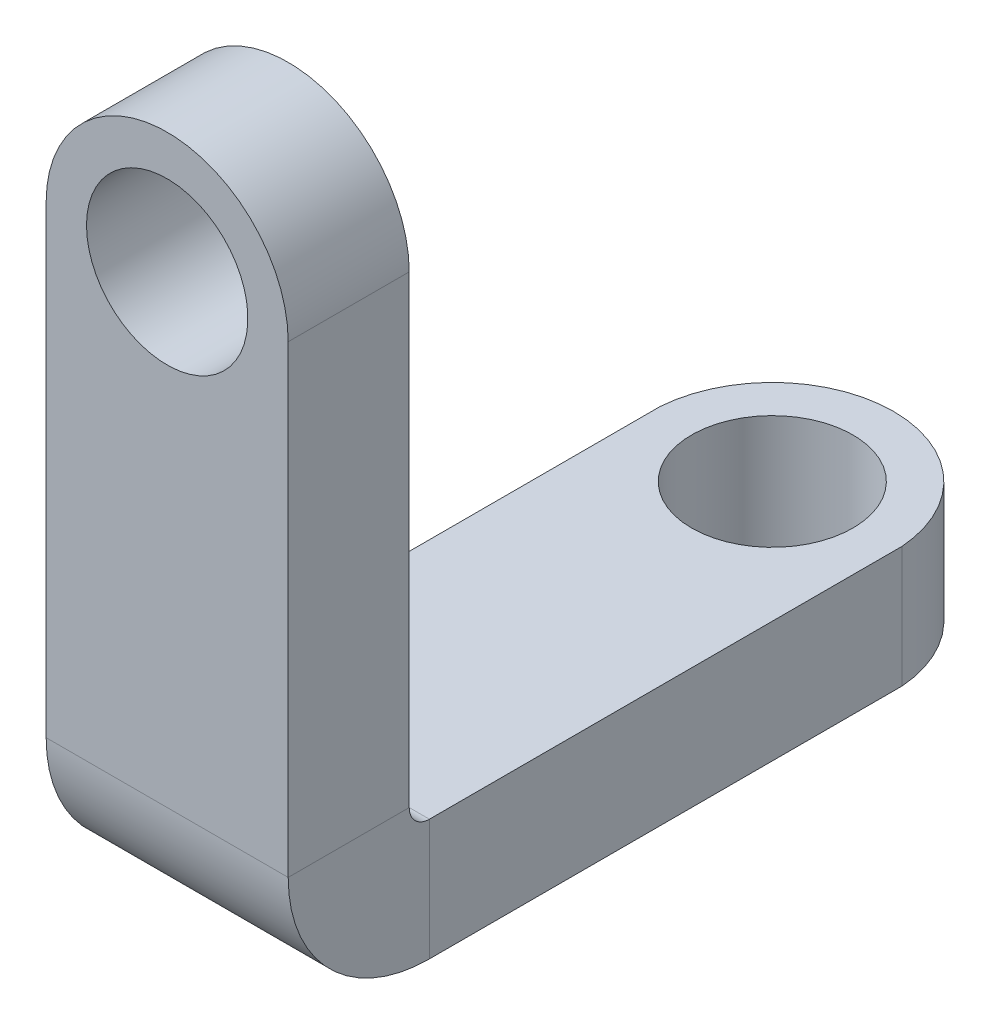
ISO-10303-21;
HEADER;
FILE_DESCRIPTION(('STEP AP214'),'2;1');
FILE_NAME('part.step','',(''),(''),'','','');
FILE_SCHEMA(('AUTOMOTIVE_DESIGN { 1 0 10303 214 1 1 1 1 }'));
ENDSEC;
DATA;
#1=APPLICATION_CONTEXT('core data for automotive mechanical design processes');
#2=APPLICATION_PROTOCOL_DEFINITION('international standard','automotive_design',2000,#1);
#3=PRODUCT_CONTEXT('',#1,'mechanical');
#4=PRODUCT('Part','Part','',(#3));
#5=PRODUCT_RELATED_PRODUCT_CATEGORY('part','',(#4));
#6=PRODUCT_DEFINITION_FORMATION('','',#4);
#7=PRODUCT_DEFINITION_CONTEXT('part definition',#1,'design');
#8=PRODUCT_DEFINITION('design','',#6,#7);
#9=PRODUCT_DEFINITION_SHAPE('','',#8);
#10=(LENGTH_UNIT() NAMED_UNIT(*) SI_UNIT(.MILLI.,.METRE.));
#11=(NAMED_UNIT(*) PLANE_ANGLE_UNIT() SI_UNIT($,.RADIAN.));
#12=(NAMED_UNIT(*) SI_UNIT($,.STERADIAN.) SOLID_ANGLE_UNIT());
#13=UNCERTAINTY_MEASURE_WITH_UNIT(LENGTH_MEASURE(1.E-05),#10,'distance_accuracy_value','');
#14=(GEOMETRIC_REPRESENTATION_CONTEXT(3) GLOBAL_UNCERTAINTY_ASSIGNED_CONTEXT((#13)) GLOBAL_UNIT_ASSIGNED_CONTEXT((#10,
#11,#12)) REPRESENTATION_CONTEXT('',''));
#15=CARTESIAN_POINT('',(0.,0.,0.));
#16=DIRECTION('',(0.,0.,1.));
#17=DIRECTION('',(1.,0.,0.));
#18=AXIS2_PLACEMENT_3D('',#15,#16,#17);
#19=CARTESIAN_POINT('',(3.,20.,15.));
#20=DIRECTION('',(-1.,0.,0.));
#21=DIRECTION('',(0.,-1.,0.));
#22=AXIS2_PLACEMENT_3D('',#19,#20,#21);
#23=PLANE('',#22);
#24=DIRECTION('',(0.,0.,1.));
#25=VECTOR('',#24,1.);
#26=CARTESIAN_POINT('',(3.,15.,15.));
#27=LINE('',#26,#25);
#28=CARTESIAN_POINT('',(3.,15.,15.));
#29=VERTEX_POINT('',#28);
#30=CARTESIAN_POINT('',(3.,15.,12.));
#31=VERTEX_POINT('',#30);
#32=EDGE_CURVE('E48',#29,#31,#27,.F.);
#33=ORIENTED_EDGE('',*,*,#32,.F.);
#34=DIRECTION('',(0.,1.,0.));
#35=VECTOR('',#34,1.);
#36=CARTESIAN_POINT('',(3.,20.,15.));
#37=LINE('',#36,#35);
#38=CARTESIAN_POINT('',(3.,3.5,15.));
#39=VERTEX_POINT('',#38);
#40=EDGE_CURVE('E126',#39,#29,#37,.T.);
#41=ORIENTED_EDGE('',*,*,#40,.F.);
#42=DIRECTION('',(0.,0.,1.));
#43=VECTOR('',#42,1.);
#44=CARTESIAN_POINT('',(3.,3.5,12.));
#45=LINE('',#44,#43);
#46=CARTESIAN_POINT('',(3.,3.5,12.));
#47=VERTEX_POINT('',#46);
#48=EDGE_CURVE('E123',#47,#39,#45,.T.);
#49=ORIENTED_EDGE('',*,*,#48,.F.);
#50=DIRECTION('',(0.,1.,0.));
#51=VECTOR('',#50,1.);
#52=CARTESIAN_POINT('',(3.,20.,12.));
#53=LINE('',#52,#51);
#54=EDGE_CURVE('E119',#47,#31,#53,.T.);
#55=ORIENTED_EDGE('',*,*,#54,.T.);
#56=EDGE_LOOP('',(#33,#41,#49,#55));
#57=FACE_BOUND('',#56,.T.);
#58=ADVANCED_FACE('F33',(#57),#23,.F.);
#59=CARTESIAN_POINT('',(-3.,20.,15.));
#60=DIRECTION('',(0.,0.,-1.));
#61=DIRECTION('',(-1.,0.,0.));
#62=AXIS2_PLACEMENT_3D('',#59,#60,#61);
#63=PLANE('',#62);
#64=CARTESIAN_POINT('',(0.,15.,15.));
#65=DIRECTION('',(0.,0.,-1.));
#66=DIRECTION('',(-1.,0.,0.));
#67=AXIS2_PLACEMENT_3D('',#64,#65,#66);
#68=CIRCLE('',#67,2.);
#69=CARTESIAN_POINT('',(-2.,15.,15.));
#70=VERTEX_POINT('',#69);
#71=EDGE_CURVE('E249',#70,#70,#68,.T.);
#72=ORIENTED_EDGE('',*,*,#71,.T.);
#73=EDGE_LOOP('',(#72));
#74=FACE_BOUND('',#73,.T.);
#75=CARTESIAN_POINT('',(0.,15.,15.));
#76=DIRECTION('',(0.,0.,-1.));
#77=DIRECTION('',(-1.,0.,0.));
#78=AXIS2_PLACEMENT_3D('',#75,#76,#77);
#79=CIRCLE('',#78,3.);
#80=CARTESIAN_POINT('',(-3.,15.,15.));
#81=VERTEX_POINT('',#80);
#82=EDGE_CURVE('E105',#29,#81,#79,.F.);
#83=ORIENTED_EDGE('',*,*,#82,.T.);
#84=DIRECTION('',(0.,-1.,0.));
#85=VECTOR('',#84,1.);
#86=CARTESIAN_POINT('',(-3.,3.,15.));
#87=LINE('',#86,#85);
#88=CARTESIAN_POINT('',(-3.,3.5,15.));
#89=VERTEX_POINT('',#88);
#90=EDGE_CURVE('E113',#81,#89,#87,.T.);
#91=ORIENTED_EDGE('',*,*,#90,.T.);
#92=DIRECTION('',(-1.,0.,0.));
#93=VECTOR('',#92,1.);
#94=CARTESIAN_POINT('',(-3.,3.5,15.));
#95=LINE('',#94,#93);
#96=EDGE_CURVE('E120',#39,#89,#95,.T.);
#97=ORIENTED_EDGE('',*,*,#96,.F.);
#98=ORIENTED_EDGE('',*,*,#40,.T.);
#99=EDGE_LOOP('',(#83,#91,#97,#98));
#100=FACE_BOUND('',#99,.T.);
#101=ADVANCED_FACE('F193',(#74,#100),#63,.F.);
#102=CARTESIAN_POINT('',(-3.,20.,12.));
#103=DIRECTION('',(0.,0.,-1.));
#104=DIRECTION('',(-1.,0.,0.));
#105=AXIS2_PLACEMENT_3D('',#102,#103,#104);
#106=PLANE('',#105);
#107=CARTESIAN_POINT('',(0.,15.,12.));
#108=DIRECTION('',(0.,0.,-1.));
#109=DIRECTION('',(-1.,0.,0.));
#110=AXIS2_PLACEMENT_3D('',#107,#108,#109);
#111=CIRCLE('',#110,2.);
#112=CARTESIAN_POINT('',(-2.,15.,12.));
#113=VERTEX_POINT('',#112);
#114=EDGE_CURVE('E114',#113,#113,#111,.T.);
#115=ORIENTED_EDGE('',*,*,#114,.F.);
#116=EDGE_LOOP('',(#115));
#117=FACE_BOUND('',#116,.T.);
#118=DIRECTION('',(0.,-1.,0.));
#119=VECTOR('',#118,1.);
#120=CARTESIAN_POINT('',(-3.,3.,12.));
#121=LINE('',#120,#119);
#122=CARTESIAN_POINT('',(-3.,15.,12.));
#123=VERTEX_POINT('',#122);
#124=CARTESIAN_POINT('',(-3.,3.5,12.));
#125=VERTEX_POINT('',#124);
#126=EDGE_CURVE('E111',#123,#125,#121,.T.);
#127=ORIENTED_EDGE('',*,*,#126,.F.);
#128=CARTESIAN_POINT('',(0.,15.,12.));
#129=DIRECTION('',(0.,0.,-1.));
#130=DIRECTION('',(-1.,0.,0.));
#131=AXIS2_PLACEMENT_3D('',#128,#129,#130);
#132=CIRCLE('',#131,3.);
#133=EDGE_CURVE('E96',#31,#123,#132,.F.);
#134=ORIENTED_EDGE('',*,*,#133,.F.);
#135=ORIENTED_EDGE('',*,*,#54,.F.);
#136=DIRECTION('',(1.,0.,0.));
#137=VECTOR('',#136,1.);
#138=CARTESIAN_POINT('',(-3.,3.5,12.));
#139=LINE('',#138,#137);
#140=EDGE_CURVE('E118',#125,#47,#139,.T.);
#141=ORIENTED_EDGE('',*,*,#140,.F.);
#142=EDGE_LOOP('',(#127,#134,#135,#141));
#143=FACE_BOUND('',#142,.T.);
#144=ADVANCED_FACE('F117',(#117,#143),#106,.T.);
#145=CARTESIAN_POINT('',(3.,3.,12.));
#146=DIRECTION('',(-1.,0.,0.));
#147=DIRECTION('',(0.,0.,-1.));
#148=AXIS2_PLACEMENT_3D('',#145,#146,#147);
#149=PLANE('',#148);
#150=DIRECTION('',(0.,0.,-1.));
#151=VECTOR('',#150,1.);
#152=CARTESIAN_POINT('',(3.,3.,12.));
#153=LINE('',#152,#151);
#154=CARTESIAN_POINT('',(3.,3.,11.5));
#155=VERTEX_POINT('',#154);
#156=CARTESIAN_POINT('',(3.,3.,-0.215556293797839));
#157=VERTEX_POINT('',#156);
#158=EDGE_CURVE('E157',#155,#157,#153,.T.);
#159=ORIENTED_EDGE('',*,*,#158,.F.);
#160=DIRECTION('',(0.,-1.,0.));
#161=VECTOR('',#160,1.);
#162=CARTESIAN_POINT('',(3.,3.,11.5));
#163=LINE('',#162,#161);
#164=CARTESIAN_POINT('',(3.,0.,11.5));
#165=VERTEX_POINT('',#164);
#166=EDGE_CURVE('E134',#155,#165,#163,.T.);
#167=ORIENTED_EDGE('',*,*,#166,.T.);
#168=DIRECTION('',(0.,0.,-1.));
#169=VECTOR('',#168,1.);
#170=CARTESIAN_POINT('',(3.,0.,0.));
#171=LINE('',#170,#169);
#172=CARTESIAN_POINT('',(3.,0.,-0.215556293797839));
#173=VERTEX_POINT('',#172);
#174=EDGE_CURVE('E165',#165,#173,#171,.T.);
#175=ORIENTED_EDGE('',*,*,#174,.T.);
#176=DIRECTION('',(0.,1.,0.));
#177=VECTOR('',#176,1.);
#178=CARTESIAN_POINT('',(3.,3.,-0.215556293797839));
#179=LINE('',#178,#177);
#180=EDGE_CURVE('E11',#173,#157,#179,.T.);
#181=ORIENTED_EDGE('',*,*,#180,.T.);
#182=EDGE_LOOP('',(#159,#167,#175,#181));
#183=FACE_BOUND('',#182,.T.);
#184=ADVANCED_FACE('F218',(#183),#149,.F.);
#185=CARTESIAN_POINT('',(0.,3.,0.));
#186=DIRECTION('',(0.,-1.,0.));
#187=DIRECTION('',(0.,0.,-1.));
#188=AXIS2_PLACEMENT_3D('',#185,#186,#187);
#189=PLANE('',#188);
#190=CARTESIAN_POINT('',(0.,3.,0.));
#191=DIRECTION('',(0.,1.,0.));
#192=DIRECTION('',(0.,0.,1.));
#193=AXIS2_PLACEMENT_3D('',#190,#191,#192);
#194=CIRCLE('',#193,2.);
#195=CARTESIAN_POINT('',(0.,3.,2.));
#196=VERTEX_POINT('',#195);
#197=EDGE_CURVE('E159',#196,#196,#194,.T.);
#198=ORIENTED_EDGE('',*,*,#197,.F.);
#199=EDGE_LOOP('',(#198));
#200=FACE_BOUND('',#199,.T.);
#201=DIRECTION('',(1.,0.,0.));
#202=VECTOR('',#201,1.);
#203=CARTESIAN_POINT('',(3.,3.,11.5));
#204=LINE('',#203,#202);
#205=CARTESIAN_POINT('',(-3.,3.,11.5));
#206=VERTEX_POINT('',#205);
#207=EDGE_CURVE('E140',#155,#206,#204,.F.);
#208=ORIENTED_EDGE('',*,*,#207,.F.);
#209=ORIENTED_EDGE('',*,*,#158,.T.);
#210=CARTESIAN_POINT('',(0.,3.,0.));
#211=DIRECTION('',(0.,1.,0.));
#212=DIRECTION('',(0.,0.,-1.));
#213=AXIS2_PLACEMENT_3D('',#210,#211,#212);
#214=CIRCLE('',#213,3.00773411653954);
#215=CARTESIAN_POINT('',(-3.,3.,-0.215556293797851));
#216=VERTEX_POINT('',#215);
#217=EDGE_CURVE('E150',#157,#216,#214,.T.);
#218=ORIENTED_EDGE('',*,*,#217,.T.);
#219=DIRECTION('',(0.,0.,1.));
#220=VECTOR('',#219,1.);
#221=CARTESIAN_POINT('',(-3.,3.,12.));
#222=LINE('',#221,#220);
#223=EDGE_CURVE('E153',#216,#206,#222,.T.);
#224=ORIENTED_EDGE('',*,*,#223,.T.);
#225=EDGE_LOOP('',(#208,#209,#218,#224));
#226=FACE_BOUND('',#225,.T.);
#227=ADVANCED_FACE('F215',(#200,#226),#189,.F.);
#228=CARTESIAN_POINT('',(0.,0.,0.));
#229=DIRECTION('',(0.,-1.,0.));
#230=DIRECTION('',(0.,0.,-1.));
#231=AXIS2_PLACEMENT_3D('',#228,#229,#230);
#232=PLANE('',#231);
#233=CARTESIAN_POINT('',(0.,0.,0.));
#234=DIRECTION('',(0.,1.,0.));
#235=DIRECTION('',(0.,0.,1.));
#236=AXIS2_PLACEMENT_3D('',#233,#234,#235);
#237=CIRCLE('',#236,2.);
#238=CARTESIAN_POINT('',(0.,0.,2.));
#239=VERTEX_POINT('',#238);
#240=EDGE_CURVE('E154',#239,#239,#237,.T.);
#241=ORIENTED_EDGE('',*,*,#240,.T.);
#242=EDGE_LOOP('',(#241));
#243=FACE_BOUND('',#242,.T.);
#244=ORIENTED_EDGE('',*,*,#174,.F.);
#245=DIRECTION('',(1.,0.,0.));
#246=VECTOR('',#245,1.);
#247=CARTESIAN_POINT('',(3.,0.,11.5));
#248=LINE('',#247,#246);
#249=CARTESIAN_POINT('',(-3.,0.,11.5));
#250=VERTEX_POINT('',#249);
#251=EDGE_CURVE('E129',#165,#250,#248,.F.);
#252=ORIENTED_EDGE('',*,*,#251,.T.);
#253=DIRECTION('',(0.,0.,-1.));
#254=VECTOR('',#253,1.);
#255=CARTESIAN_POINT('',(-3.,0.,0.));
#256=LINE('',#255,#254);
#257=CARTESIAN_POINT('',(-3.,0.,-0.215556293797851));
#258=VERTEX_POINT('',#257);
#259=EDGE_CURVE('E164',#258,#250,#256,.F.);
#260=ORIENTED_EDGE('',*,*,#259,.F.);
#261=CARTESIAN_POINT('',(0.,0.,0.));
#262=DIRECTION('',(0.,1.,0.));
#263=DIRECTION('',(0.,0.,1.));
#264=AXIS2_PLACEMENT_3D('',#261,#262,#263);
#265=CIRCLE('',#264,3.00773411653954);
#266=EDGE_CURVE('E147',#173,#258,#265,.T.);
#267=ORIENTED_EDGE('',*,*,#266,.F.);
#268=EDGE_LOOP('',(#244,#252,#260,#267));
#269=FACE_BOUND('',#268,.T.);
#270=ADVANCED_FACE('F172',(#243,#269),#232,.T.);
#271=CARTESIAN_POINT('',(0.,3.,0.));
#272=DIRECTION('',(0.,1.,0.));
#273=DIRECTION('',(0.,0.,1.));
#274=AXIS2_PLACEMENT_3D('',#271,#272,#273);
#275=CYLINDRICAL_SURFACE('',#274,3.00773411653954);
#276=ORIENTED_EDGE('',*,*,#180,.F.);
#277=ORIENTED_EDGE('',*,*,#266,.T.);
#278=DIRECTION('',(0.,1.,0.));
#279=VECTOR('',#278,1.);
#280=CARTESIAN_POINT('',(-3.,3.,-0.215556293797851));
#281=LINE('',#280,#279);
#282=EDGE_CURVE('E37',#258,#216,#281,.T.);
#283=ORIENTED_EDGE('',*,*,#282,.T.);
#284=ORIENTED_EDGE('',*,*,#217,.F.);
#285=EDGE_LOOP('',(#276,#277,#283,#284));
#286=FACE_BOUND('',#285,.T.);
#287=ADVANCED_FACE('F179',(#286),#275,.T.);
#288=CARTESIAN_POINT('',(-3.,3.,12.));
#289=DIRECTION('',(1.,0.,0.));
#290=DIRECTION('',(0.,0.,1.));
#291=AXIS2_PLACEMENT_3D('',#288,#289,#290);
#292=PLANE('',#291);
#293=DIRECTION('',(0.,-1.,0.));
#294=VECTOR('',#293,1.);
#295=CARTESIAN_POINT('',(-3.,3.,11.5));
#296=LINE('',#295,#294);
#297=EDGE_CURVE('E145',#206,#250,#296,.T.);
#298=ORIENTED_EDGE('',*,*,#297,.F.);
#299=ORIENTED_EDGE('',*,*,#223,.F.);
#300=ORIENTED_EDGE('',*,*,#282,.F.);
#301=ORIENTED_EDGE('',*,*,#259,.T.);
#302=EDGE_LOOP('',(#298,#299,#300,#301));
#303=FACE_BOUND('',#302,.T.);
#304=ADVANCED_FACE('F177',(#303),#292,.F.);
#305=CARTESIAN_POINT('',(0.,3.,0.));
#306=DIRECTION('',(0.,1.,0.));
#307=DIRECTION('',(0.,0.,1.));
#308=AXIS2_PLACEMENT_3D('',#305,#306,#307);
#309=CYLINDRICAL_SURFACE('',#308,2.);
#310=ORIENTED_EDGE('',*,*,#197,.T.);
#311=EDGE_LOOP('',(#310));
#312=FACE_BOUND('',#311,.T.);
#313=ORIENTED_EDGE('',*,*,#240,.F.);
#314=EDGE_LOOP('',(#313));
#315=FACE_BOUND('',#314,.T.);
#316=ADVANCED_FACE('F35',(#312,#315),#309,.F.);
#317=CARTESIAN_POINT('',(-3.,3.5,11.5));
#318=DIRECTION('',(-1.,0.,0.));
#319=DIRECTION('',(0.,0.,1.));
#320=AXIS2_PLACEMENT_3D('',#317,#318,#319);
#321=PLANE('',#320);
#322=DIRECTION('',(0.,0.,1.));
#323=VECTOR('',#322,1.);
#324=CARTESIAN_POINT('',(-3.,3.5,12.));
#325=LINE('',#324,#323);
#326=EDGE_CURVE('E238',#125,#89,#325,.T.);
#327=ORIENTED_EDGE('',*,*,#326,.F.);
#328=CARTESIAN_POINT('',(-3.,3.5,11.5));
#329=DIRECTION('',(1.,0.,0.));
#330=DIRECTION('',(0.,0.,-1.));
#331=AXIS2_PLACEMENT_3D('',#328,#329,#330);
#332=CIRCLE('',#331,0.5);
#333=EDGE_CURVE('E137',#206,#125,#332,.F.);
#334=ORIENTED_EDGE('',*,*,#333,.F.);
#335=ORIENTED_EDGE('',*,*,#297,.T.);
#336=CARTESIAN_POINT('',(-3.,3.5,11.5));
#337=DIRECTION('',(1.,0.,0.));
#338=DIRECTION('',(0.,0.,-1.));
#339=AXIS2_PLACEMENT_3D('',#336,#337,#338);
#340=CIRCLE('',#339,3.5);
#341=EDGE_CURVE('E56',#250,#89,#340,.F.);
#342=ORIENTED_EDGE('',*,*,#341,.T.);
#343=EDGE_LOOP('',(#327,#334,#335,#342));
#344=FACE_BOUND('',#343,.T.);
#345=ADVANCED_FACE('F176',(#344),#321,.T.);
#346=CARTESIAN_POINT('',(3.,3.5,11.5));
#347=DIRECTION('',(-1.,0.,0.));
#348=DIRECTION('',(0.,0.,1.));
#349=AXIS2_PLACEMENT_3D('',#346,#347,#348);
#350=PLANE('',#349);
#351=CARTESIAN_POINT('',(3.,3.5,11.5));
#352=DIRECTION('',(1.,0.,0.));
#353=DIRECTION('',(0.,0.,-1.));
#354=AXIS2_PLACEMENT_3D('',#351,#352,#353);
#355=CIRCLE('',#354,0.5);
#356=EDGE_CURVE('E142',#47,#155,#355,.T.);
#357=ORIENTED_EDGE('',*,*,#356,.F.);
#358=ORIENTED_EDGE('',*,*,#48,.T.);
#359=CARTESIAN_POINT('',(3.,3.5,11.5));
#360=DIRECTION('',(1.,0.,0.));
#361=DIRECTION('',(0.,0.,-1.));
#362=AXIS2_PLACEMENT_3D('',#359,#360,#361);
#363=CIRCLE('',#362,3.5);
#364=EDGE_CURVE('E132',#39,#165,#363,.T.);
#365=ORIENTED_EDGE('',*,*,#364,.T.);
#366=ORIENTED_EDGE('',*,*,#166,.F.);
#367=EDGE_LOOP('',(#357,#358,#365,#366));
#368=FACE_BOUND('',#367,.T.);
#369=ADVANCED_FACE('F184',(#368),#350,.F.);
#370=CARTESIAN_POINT('',(3.,3.5,11.5));
#371=DIRECTION('',(1.,0.,0.));
#372=DIRECTION('',(0.,0.,1.));
#373=AXIS2_PLACEMENT_3D('',#370,#371,#372);
#374=CYLINDRICAL_SURFACE('',#373,3.5);
#375=ORIENTED_EDGE('',*,*,#251,.F.);
#376=ORIENTED_EDGE('',*,*,#364,.F.);
#377=ORIENTED_EDGE('',*,*,#96,.T.);
#378=ORIENTED_EDGE('',*,*,#341,.F.);
#379=EDGE_LOOP('',(#375,#376,#377,#378));
#380=FACE_BOUND('',#379,.T.);
#381=ADVANCED_FACE('F187',(#380),#374,.T.);
#382=CARTESIAN_POINT('',(3.,3.5,11.5));
#383=DIRECTION('',(1.,0.,0.));
#384=DIRECTION('',(0.,0.,1.));
#385=AXIS2_PLACEMENT_3D('',#382,#383,#384);
#386=CYLINDRICAL_SURFACE('',#385,0.5);
#387=ORIENTED_EDGE('',*,*,#207,.T.);
#388=ORIENTED_EDGE('',*,*,#333,.T.);
#389=ORIENTED_EDGE('',*,*,#140,.T.);
#390=ORIENTED_EDGE('',*,*,#356,.T.);
#391=EDGE_LOOP('',(#387,#388,#389,#390));
#392=FACE_BOUND('',#391,.T.);
#393=ADVANCED_FACE('F206',(#392),#386,.F.);
#394=CARTESIAN_POINT('',(-3.,3.,15.));
#395=DIRECTION('',(1.,0.,0.));
#396=DIRECTION('',(0.,1.,0.));
#397=AXIS2_PLACEMENT_3D('',#394,#395,#396);
#398=PLANE('',#397);
#399=ORIENTED_EDGE('',*,*,#90,.F.);
#400=DIRECTION('',(0.,0.,1.));
#401=VECTOR('',#400,1.);
#402=CARTESIAN_POINT('',(-3.,15.,15.));
#403=LINE('',#402,#401);
#404=EDGE_CURVE('E99',#81,#123,#403,.F.);
#405=ORIENTED_EDGE('',*,*,#404,.T.);
#406=ORIENTED_EDGE('',*,*,#126,.T.);
#407=ORIENTED_EDGE('',*,*,#326,.T.);
#408=EDGE_LOOP('',(#399,#405,#406,#407));
#409=FACE_BOUND('',#408,.T.);
#410=ADVANCED_FACE('F109',(#409),#398,.F.);
#411=CARTESIAN_POINT('',(0.,15.,15.));
#412=DIRECTION('',(0.,0.,-1.));
#413=DIRECTION('',(-1.,0.,0.));
#414=AXIS2_PLACEMENT_3D('',#411,#412,#413);
#415=CYLINDRICAL_SURFACE('',#414,2.);
#416=ORIENTED_EDGE('',*,*,#71,.F.);
#417=EDGE_LOOP('',(#416));
#418=FACE_BOUND('',#417,.T.);
#419=ORIENTED_EDGE('',*,*,#114,.T.);
#420=EDGE_LOOP('',(#419));
#421=FACE_BOUND('',#420,.T.);
#422=ADVANCED_FACE('F205',(#418,#421),#415,.F.);
#423=CARTESIAN_POINT('',(0.,15.,15.));
#424=DIRECTION('',(0.,0.,-1.));
#425=DIRECTION('',(-1.,0.,0.));
#426=AXIS2_PLACEMENT_3D('',#423,#424,#425);
#427=CYLINDRICAL_SURFACE('',#426,3.);
#428=ORIENTED_EDGE('',*,*,#404,.F.);
#429=ORIENTED_EDGE('',*,*,#82,.F.);
#430=ORIENTED_EDGE('',*,*,#32,.T.);
#431=ORIENTED_EDGE('',*,*,#133,.T.);
#432=EDGE_LOOP('',(#428,#429,#430,#431));
#433=FACE_BOUND('',#432,.T.);
#434=ADVANCED_FACE('F98',(#433),#427,.T.);
#435=CLOSED_SHELL('',(#58,#101,#144,#184,#227,#270,#287,#304,#316,#345,#369,#381,#393,#410,#422,#434));
#436=MANIFOLD_SOLID_BREP('B2',#435);
#437=ADVANCED_BREP_SHAPE_REPRESENTATION('',(#18,#436),#14);
#438=SHAPE_DEFINITION_REPRESENTATION(#9,#437);
ENDSEC;
END-ISO-10303-21;
